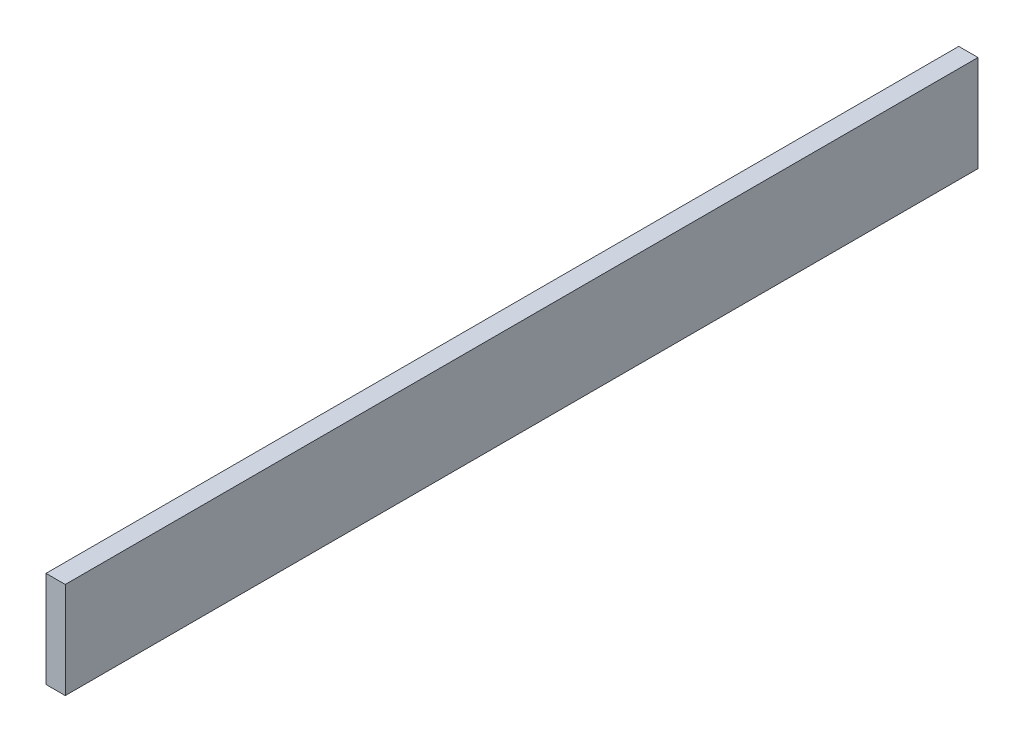
ISO-10303-21;
HEADER;
FILE_DESCRIPTION(('STEP AP214'),'2;1');
FILE_NAME('part.step','',(''),(''),'','','');
FILE_SCHEMA(('AUTOMOTIVE_DESIGN { 1 0 10303 214 1 1 1 1 }'));
ENDSEC;
DATA;
#1=APPLICATION_CONTEXT('core data for automotive mechanical design processes');
#2=APPLICATION_PROTOCOL_DEFINITION('international standard','automotive_design',2000,#1);
#3=PRODUCT_CONTEXT('',#1,'mechanical');
#4=PRODUCT('Part','Part','',(#3));
#5=PRODUCT_RELATED_PRODUCT_CATEGORY('part','',(#4));
#6=PRODUCT_DEFINITION_FORMATION('','',#4);
#7=PRODUCT_DEFINITION_CONTEXT('part definition',#1,'design');
#8=PRODUCT_DEFINITION('design','',#6,#7);
#9=PRODUCT_DEFINITION_SHAPE('','',#8);
#10=(LENGTH_UNIT() NAMED_UNIT(*) SI_UNIT(.MILLI.,.METRE.));
#11=(NAMED_UNIT(*) PLANE_ANGLE_UNIT() SI_UNIT($,.RADIAN.));
#12=(NAMED_UNIT(*) SI_UNIT($,.STERADIAN.) SOLID_ANGLE_UNIT());
#13=UNCERTAINTY_MEASURE_WITH_UNIT(LENGTH_MEASURE(1.E-05),#10,'distance_accuracy_value','');
#14=(GEOMETRIC_REPRESENTATION_CONTEXT(3) GLOBAL_UNCERTAINTY_ASSIGNED_CONTEXT((#13)) GLOBAL_UNIT_ASSIGNED_CONTEXT((#10,
#11,#12)) REPRESENTATION_CONTEXT('',''));
#15=CARTESIAN_POINT('',(0.,0.,0.));
#16=DIRECTION('',(0.,0.,1.));
#17=DIRECTION('',(1.,0.,0.));
#18=AXIS2_PLACEMENT_3D('',#15,#16,#17);
#19=CARTESIAN_POINT('',(281.,74.8919626313153,81.035636223129));
#20=DIRECTION('',(0.,0.,1.));
#21=DIRECTION('',(1.,0.,0.));
#22=AXIS2_PLACEMENT_3D('',#19,#20,#21);
#23=PLANE('',#22);
#24=DIRECTION('',(0.,-1.,0.));
#25=VECTOR('',#24,1.);
#26=CARTESIAN_POINT('',(280.,74.8919626313153,81.035636223129));
#27=LINE('',#26,#25);
#28=CARTESIAN_POINT('',(280.,74.8919626313153,81.035636223129));
#29=VERTEX_POINT('',#28);
#30=CARTESIAN_POINT('',(280.,69.8919626313152,81.035636223129));
#31=VERTEX_POINT('',#30);
#32=EDGE_CURVE('E101',#29,#31,#27,.T.);
#33=ORIENTED_EDGE('',*,*,#32,.F.);
#34=DIRECTION('',(-1.,0.,0.));
#35=VECTOR('',#34,1.);
#36=CARTESIAN_POINT('',(281.,74.8919626313153,81.035636223129));
#37=LINE('',#36,#35);
#38=CARTESIAN_POINT('',(281.,74.8919626313153,81.035636223129));
#39=VERTEX_POINT('',#38);
#40=EDGE_CURVE('E100',#39,#29,#37,.T.);
#41=ORIENTED_EDGE('',*,*,#40,.F.);
#42=DIRECTION('',(0.,-1.,0.));
#43=VECTOR('',#42,1.);
#44=CARTESIAN_POINT('',(281.,74.8919626313153,81.035636223129));
#45=LINE('',#44,#43);
#46=CARTESIAN_POINT('',(281.,69.8919626313152,81.035636223129));
#47=VERTEX_POINT('',#46);
#48=EDGE_CURVE('E95',#39,#47,#45,.T.);
#49=ORIENTED_EDGE('',*,*,#48,.T.);
#50=DIRECTION('',(-1.,0.,0.));
#51=VECTOR('',#50,1.);
#52=CARTESIAN_POINT('',(281.,69.8919626313152,81.035636223129));
#53=LINE('',#52,#51);
#54=EDGE_CURVE('E11',#47,#31,#53,.T.);
#55=ORIENTED_EDGE('',*,*,#54,.T.);
#56=EDGE_LOOP('',(#33,#41,#49,#55));
#57=FACE_BOUND('',#56,.T.);
#58=ADVANCED_FACE('F38',(#57),#23,.F.);
#59=CARTESIAN_POINT('',(281.,69.8919626313152,81.035636223129));
#60=DIRECTION('',(0.,1.,0.));
#61=DIRECTION('',(0.,0.,-1.));
#62=AXIS2_PLACEMENT_3D('',#59,#60,#61);
#63=PLANE('',#62);
#64=DIRECTION('',(0.,0.,1.));
#65=VECTOR('',#64,1.);
#66=CARTESIAN_POINT('',(280.,69.8919626313152,81.035636223129));
#67=LINE('',#66,#65);
#68=CARTESIAN_POINT('',(280.,69.8919626313152,128.442125645559));
#69=VERTEX_POINT('',#68);
#70=EDGE_CURVE('E103',#31,#69,#67,.T.);
#71=ORIENTED_EDGE('',*,*,#70,.F.);
#72=ORIENTED_EDGE('',*,*,#54,.F.);
#73=DIRECTION('',(0.,0.,1.));
#74=VECTOR('',#73,1.);
#75=CARTESIAN_POINT('',(281.,69.8919626313152,81.035636223129));
#76=LINE('',#75,#74);
#77=CARTESIAN_POINT('',(281.,69.8919626313152,128.442125645559));
#78=VERTEX_POINT('',#77);
#79=EDGE_CURVE('E79',#47,#78,#76,.T.);
#80=ORIENTED_EDGE('',*,*,#79,.T.);
#81=DIRECTION('',(-1.,0.,0.));
#82=VECTOR('',#81,1.);
#83=CARTESIAN_POINT('',(281.,69.8919626313152,128.442125645559));
#84=LINE('',#83,#82);
#85=EDGE_CURVE('E46',#78,#69,#84,.T.);
#86=ORIENTED_EDGE('',*,*,#85,.T.);
#87=EDGE_LOOP('',(#71,#72,#80,#86));
#88=FACE_BOUND('',#87,.T.);
#89=ADVANCED_FACE('F93',(#88),#63,.F.);
#90=CARTESIAN_POINT('',(281.,74.8919626313153,128.442125645559));
#91=DIRECTION('',(0.,0.,-1.));
#92=DIRECTION('',(-1.,0.,0.));
#93=AXIS2_PLACEMENT_3D('',#90,#91,#92);
#94=PLANE('',#93);
#95=DIRECTION('',(0.,1.,0.));
#96=VECTOR('',#95,1.);
#97=CARTESIAN_POINT('',(280.,74.8919626313153,128.442125645559));
#98=LINE('',#97,#96);
#99=CARTESIAN_POINT('',(280.,74.8919626313153,128.442125645559));
#100=VERTEX_POINT('',#99);
#101=EDGE_CURVE('E89',#69,#100,#98,.T.);
#102=ORIENTED_EDGE('',*,*,#101,.F.);
#103=ORIENTED_EDGE('',*,*,#85,.F.);
#104=DIRECTION('',(0.,1.,0.));
#105=VECTOR('',#104,1.);
#106=CARTESIAN_POINT('',(281.,74.8919626313153,128.442125645559));
#107=LINE('',#106,#105);
#108=CARTESIAN_POINT('',(281.,74.8919626313153,128.442125645559));
#109=VERTEX_POINT('',#108);
#110=EDGE_CURVE('E82',#78,#109,#107,.T.);
#111=ORIENTED_EDGE('',*,*,#110,.T.);
#112=DIRECTION('',(-1.,0.,0.));
#113=VECTOR('',#112,1.);
#114=CARTESIAN_POINT('',(281.,74.8919626313153,128.442125645559));
#115=LINE('',#114,#113);
#116=EDGE_CURVE('E92',#109,#100,#115,.T.);
#117=ORIENTED_EDGE('',*,*,#116,.T.);
#118=EDGE_LOOP('',(#102,#103,#111,#117));
#119=FACE_BOUND('',#118,.T.);
#120=ADVANCED_FACE('F88',(#119),#94,.F.);
#121=CARTESIAN_POINT('',(281.,74.8919626313153,81.035636223129));
#122=DIRECTION('',(0.,-1.,0.));
#123=DIRECTION('',(0.,0.,1.));
#124=AXIS2_PLACEMENT_3D('',#121,#122,#123);
#125=PLANE('',#124);
#126=DIRECTION('',(0.,0.,-1.));
#127=VECTOR('',#126,1.);
#128=CARTESIAN_POINT('',(280.,74.8919626313153,81.035636223129));
#129=LINE('',#128,#127);
#130=EDGE_CURVE('E68',#100,#29,#129,.T.);
#131=ORIENTED_EDGE('',*,*,#130,.F.);
#132=ORIENTED_EDGE('',*,*,#116,.F.);
#133=DIRECTION('',(0.,0.,-1.));
#134=VECTOR('',#133,1.);
#135=CARTESIAN_POINT('',(281.,74.8919626313153,81.035636223129));
#136=LINE('',#135,#134);
#137=EDGE_CURVE('E54',#109,#39,#136,.T.);
#138=ORIENTED_EDGE('',*,*,#137,.T.);
#139=ORIENTED_EDGE('',*,*,#40,.T.);
#140=EDGE_LOOP('',(#131,#132,#138,#139));
#141=FACE_BOUND('',#140,.T.);
#142=ADVANCED_FACE('F112',(#141),#125,.F.);
#143=CARTESIAN_POINT('',(281.,24.8919626313152,0.));
#144=DIRECTION('',(1.,0.,0.));
#145=DIRECTION('',(0.,0.,-1.));
#146=AXIS2_PLACEMENT_3D('',#143,#144,#145);
#147=PLANE('',#146);
#148=ORIENTED_EDGE('',*,*,#48,.F.);
#149=ORIENTED_EDGE('',*,*,#137,.F.);
#150=ORIENTED_EDGE('',*,*,#110,.F.);
#151=ORIENTED_EDGE('',*,*,#79,.F.);
#152=EDGE_LOOP('',(#148,#149,#150,#151));
#153=FACE_BOUND('',#152,.T.);
#154=ADVANCED_FACE('F84',(#153),#147,.T.);
#155=CARTESIAN_POINT('',(280.,24.8919626313152,0.));
#156=DIRECTION('',(1.,0.,0.));
#157=DIRECTION('',(0.,0.,-1.));
#158=AXIS2_PLACEMENT_3D('',#155,#156,#157);
#159=PLANE('',#158);
#160=ORIENTED_EDGE('',*,*,#32,.T.);
#161=ORIENTED_EDGE('',*,*,#70,.T.);
#162=ORIENTED_EDGE('',*,*,#101,.T.);
#163=ORIENTED_EDGE('',*,*,#130,.T.);
#164=EDGE_LOOP('',(#160,#161,#162,#163));
#165=FACE_BOUND('',#164,.T.);
#166=ADVANCED_FACE('F108',(#165),#159,.F.);
#167=CLOSED_SHELL('',(#58,#89,#120,#142,#154,#166));
#168=MANIFOLD_SOLID_BREP('B2',#167);
#169=ADVANCED_BREP_SHAPE_REPRESENTATION('',(#18,#168),#14);
#170=SHAPE_DEFINITION_REPRESENTATION(#9,#169);
ENDSEC;
END-ISO-10303-21;
